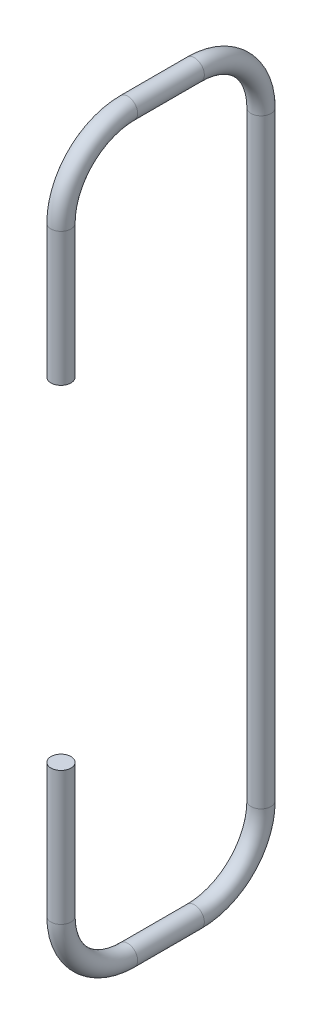
ISO-10303-21;
HEADER;
FILE_DESCRIPTION(('STEP AP214'),'2;1');
FILE_NAME('part.step','',(''),(''),'','','');
FILE_SCHEMA(('AUTOMOTIVE_DESIGN { 1 0 10303 214 1 1 1 1 }'));
ENDSEC;
DATA;
#1=APPLICATION_CONTEXT('core data for automotive mechanical design processes');
#2=APPLICATION_PROTOCOL_DEFINITION('international standard','automotive_design',2000,#1);
#3=PRODUCT_CONTEXT('',#1,'mechanical');
#4=PRODUCT('Part','Part','',(#3));
#5=PRODUCT_RELATED_PRODUCT_CATEGORY('part','',(#4));
#6=PRODUCT_DEFINITION_FORMATION('','',#4);
#7=PRODUCT_DEFINITION_CONTEXT('part definition',#1,'design');
#8=PRODUCT_DEFINITION('design','',#6,#7);
#9=PRODUCT_DEFINITION_SHAPE('','',#8);
#10=(LENGTH_UNIT() NAMED_UNIT(*) SI_UNIT(.MILLI.,.METRE.));
#11=(NAMED_UNIT(*) PLANE_ANGLE_UNIT() SI_UNIT($,.RADIAN.));
#12=(NAMED_UNIT(*) SI_UNIT($,.STERADIAN.) SOLID_ANGLE_UNIT());
#13=UNCERTAINTY_MEASURE_WITH_UNIT(LENGTH_MEASURE(1.E-05),#10,'distance_accuracy_value','');
#14=(GEOMETRIC_REPRESENTATION_CONTEXT(3) GLOBAL_UNCERTAINTY_ASSIGNED_CONTEXT((#13)) GLOBAL_UNIT_ASSIGNED_CONTEXT((#10,
#11,#12)) REPRESENTATION_CONTEXT('',''));
#15=CARTESIAN_POINT('',(0.,0.,0.));
#16=DIRECTION('',(0.,0.,1.));
#17=DIRECTION('',(1.,0.,0.));
#18=AXIS2_PLACEMENT_3D('',#15,#16,#17);
#19=CARTESIAN_POINT('',(0.,25.,30.));
#20=DIRECTION('',(0.,-1.,0.));
#21=DIRECTION('',(0.,0.,-1.));
#22=AXIS2_PLACEMENT_3D('',#19,#20,#21);
#23=PLANE('',#22);
#24=CARTESIAN_POINT('',(0.,25.,30.));
#25=DIRECTION('',(0.,-1.,0.));
#26=DIRECTION('',(0.,0.,-1.));
#27=AXIS2_PLACEMENT_3D('',#24,#25,#26);
#28=CIRCLE('',#27,1.5);
#29=CARTESIAN_POINT('',(0.,25.,28.5));
#30=VERTEX_POINT('',#29);
#31=EDGE_CURVE('E52',#30,#30,#28,.T.);
#32=ORIENTED_EDGE('',*,*,#31,.T.);
#33=EDGE_LOOP('',(#32));
#34=FACE_BOUND('',#33,.T.);
#35=ADVANCED_FACE('F33',(#34),#23,.T.);
#36=CARTESIAN_POINT('',(0.,25.,30.));
#37=DIRECTION('',(0.,1.,0.));
#38=DIRECTION('',(0.,0.,1.));
#39=AXIS2_PLACEMENT_3D('',#36,#37,#38);
#40=CYLINDRICAL_SURFACE('',#39,1.5);
#41=CARTESIAN_POINT('',(0.,45.,30.));
#42=DIRECTION('',(0.,-1.,0.));
#43=DIRECTION('',(0.,0.,-1.));
#44=AXIS2_PLACEMENT_3D('',#41,#42,#43);
#45=CIRCLE('',#44,1.5);
#46=CARTESIAN_POINT('',(0.,45.,31.5));
#47=VERTEX_POINT('',#46);
#48=EDGE_CURVE('E47',#47,#47,#45,.T.);
#49=ORIENTED_EDGE('',*,*,#48,.T.);
#50=EDGE_LOOP('',(#49));
#51=FACE_BOUND('',#50,.T.);
#52=ORIENTED_EDGE('',*,*,#31,.F.);
#53=EDGE_LOOP('',(#52));
#54=FACE_BOUND('',#53,.T.);
#55=ADVANCED_FACE('F89',(#51,#54),#40,.T.);
#56=CARTESIAN_POINT('',(0.,45.,20.));
#57=DIRECTION('',(-1.,0.,0.));
#58=DIRECTION('',(0.,0.,1.));
#59=AXIS2_PLACEMENT_3D('',#56,#57,#58);
#60=TOROIDAL_SURFACE('',#59,10.,1.5);
#61=CARTESIAN_POINT('',(0.,55.,20.));
#62=DIRECTION('',(0.,0.,1.));
#63=DIRECTION('',(0.,-1.,0.));
#64=AXIS2_PLACEMENT_3D('',#61,#62,#63);
#65=CIRCLE('',#64,1.5);
#66=CARTESIAN_POINT('',(0.,56.5,20.));
#67=VERTEX_POINT('',#66);
#68=EDGE_CURVE('E43',#67,#67,#65,.T.);
#69=CARTESIAN_POINT('',(0.,45.,20.));
#70=DIRECTION('',(-1.,0.,0.));
#71=DIRECTION('',(0.,0.,1.));
#72=AXIS2_PLACEMENT_3D('',#69,#70,#71);
#73=CIRCLE('',#72,11.5);
#74=EDGE_CURVE('',#47,#67,#73,.T.);
#75=ORIENTED_EDGE('',*,*,#48,.F.);
#76=ORIENTED_EDGE('',*,*,#68,.T.);
#77=ORIENTED_EDGE('',*,*,#74,.T.);
#78=ORIENTED_EDGE('',*,*,#74,.F.);
#79=EDGE_LOOP('',(#75,#77,#76,#78));
#80=FACE_BOUND('',#79,.T.);
#81=ADVANCED_FACE('F94',(#80),#60,.T.);
#82=CARTESIAN_POINT('',(0.,55.,20.));
#83=DIRECTION('',(0.,0.,-1.));
#84=DIRECTION('',(-1.,0.,0.));
#85=AXIS2_PLACEMENT_3D('',#82,#83,#84);
#86=CYLINDRICAL_SURFACE('',#85,1.5);
#87=CARTESIAN_POINT('',(0.,55.,9.99999999999999));
#88=DIRECTION('',(0.,0.,1.));
#89=DIRECTION('',(0.,-1.,0.));
#90=AXIS2_PLACEMENT_3D('',#87,#88,#89);
#91=CIRCLE('',#90,1.5);
#92=CARTESIAN_POINT('',(0.,56.5,9.99999999999999));
#93=VERTEX_POINT('',#92);
#94=EDGE_CURVE('E39',#93,#93,#91,.T.);
#95=ORIENTED_EDGE('',*,*,#94,.T.);
#96=EDGE_LOOP('',(#95));
#97=FACE_BOUND('',#96,.T.);
#98=ORIENTED_EDGE('',*,*,#68,.F.);
#99=EDGE_LOOP('',(#98));
#100=FACE_BOUND('',#99,.T.);
#101=ADVANCED_FACE('F101',(#97,#100),#86,.T.);
#102=CARTESIAN_POINT('',(0.,45.,10.));
#103=DIRECTION('',(-1.,0.,0.));
#104=DIRECTION('',(0.,0.,1.));
#105=AXIS2_PLACEMENT_3D('',#102,#103,#104);
#106=TOROIDAL_SURFACE('',#105,9.99999999999999,1.5);
#107=CARTESIAN_POINT('',(0.,45.,0.));
#108=DIRECTION('',(0.,1.,0.));
#109=DIRECTION('',(0.,0.,1.));
#110=AXIS2_PLACEMENT_3D('',#107,#108,#109);
#111=CIRCLE('',#110,1.5);
#112=CARTESIAN_POINT('',(0.,45.,-1.49999999999999));
#113=VERTEX_POINT('',#112);
#114=EDGE_CURVE('E10',#113,#113,#111,.T.);
#115=CARTESIAN_POINT('',(0.,45.,10.));
#116=DIRECTION('',(-1.,0.,0.));
#117=DIRECTION('',(0.,0.,1.));
#118=AXIS2_PLACEMENT_3D('',#115,#116,#117);
#119=CIRCLE('',#118,11.5);
#120=EDGE_CURVE('',#93,#113,#119,.T.);
#121=ORIENTED_EDGE('',*,*,#94,.F.);
#122=ORIENTED_EDGE('',*,*,#114,.T.);
#123=ORIENTED_EDGE('',*,*,#120,.T.);
#124=ORIENTED_EDGE('',*,*,#120,.F.);
#125=EDGE_LOOP('',(#121,#123,#122,#124));
#126=FACE_BOUND('',#125,.T.);
#127=ADVANCED_FACE('F84',(#126),#106,.T.);
#128=CARTESIAN_POINT('',(0.,45.,0.));
#129=DIRECTION('',(0.,-1.,0.));
#130=DIRECTION('',(0.,0.,-1.));
#131=AXIS2_PLACEMENT_3D('',#128,#129,#130);
#132=CYLINDRICAL_SURFACE('',#131,1.5);
#133=CARTESIAN_POINT('',(0.,-45.,0.));
#134=DIRECTION('',(0.,1.,0.));
#135=DIRECTION('',(0.,0.,1.));
#136=AXIS2_PLACEMENT_3D('',#133,#134,#135);
#137=CIRCLE('',#136,1.5);
#138=CARTESIAN_POINT('',(0.,-45.,-1.5));
#139=VERTEX_POINT('',#138);
#140=EDGE_CURVE('E55',#139,#139,#137,.T.);
#141=CARTESIAN_POINT('',(0.,45.,-1.5));
#142=CARTESIAN_POINT('',(0.,44.0625,-1.5));
#143=CARTESIAN_POINT('',(0.,43.125,-1.5));
#144=CARTESIAN_POINT('',(0.,41.25,-1.5));
#145=CARTESIAN_POINT('',(0.,40.3125,-1.5));
#146=CARTESIAN_POINT('',(0.,38.4375,-1.5));
#147=CARTESIAN_POINT('',(0.,37.5,-1.5));
#148=CARTESIAN_POINT('',(0.,35.625,-1.5));
#149=CARTESIAN_POINT('',(0.,34.6875,-1.5));
#150=CARTESIAN_POINT('',(0.,32.8125,-1.5));
#151=CARTESIAN_POINT('',(0.,31.875,-1.5));
#152=CARTESIAN_POINT('',(0.,30.,-1.5));
#153=CARTESIAN_POINT('',(0.,29.0625,-1.5));
#154=CARTESIAN_POINT('',(0.,27.1875,-1.5));
#155=CARTESIAN_POINT('',(0.,26.25,-1.5));
#156=CARTESIAN_POINT('',(0.,24.375,-1.5));
#157=CARTESIAN_POINT('',(0.,23.4375,-1.5));
#158=CARTESIAN_POINT('',(0.,21.5625,-1.5));
#159=CARTESIAN_POINT('',(0.,20.625,-1.5));
#160=CARTESIAN_POINT('',(0.,18.75,-1.5));
#161=CARTESIAN_POINT('',(0.,17.8125,-1.5));
#162=CARTESIAN_POINT('',(0.,15.9375,-1.5));
#163=CARTESIAN_POINT('',(0.,15.,-1.5));
#164=CARTESIAN_POINT('',(0.,13.125,-1.5));
#165=CARTESIAN_POINT('',(0.,12.1875,-1.5));
#166=CARTESIAN_POINT('',(0.,10.3125,-1.5));
#167=CARTESIAN_POINT('',(0.,9.37499999999999,-1.5));
#168=CARTESIAN_POINT('',(0.,7.49999999999999,-1.5));
#169=CARTESIAN_POINT('',(0.,6.56249999999999,-1.5));
#170=CARTESIAN_POINT('',(0.,4.68749999999999,-1.5));
#171=CARTESIAN_POINT('',(0.,3.74999999999999,-1.5));
#172=CARTESIAN_POINT('',(0.,1.87499999999999,-1.5));
#173=CARTESIAN_POINT('',(0.,0.937499999999994,-1.5));
#174=CARTESIAN_POINT('',(0.,-0.937500000000008,-1.5));
#175=CARTESIAN_POINT('',(0.,-1.87500000000001,-1.5));
#176=CARTESIAN_POINT('',(0.,-3.75000000000001,-1.5));
#177=CARTESIAN_POINT('',(0.,-4.68750000000001,-1.5));
#178=CARTESIAN_POINT('',(0.,-6.56250000000001,-1.5));
#179=CARTESIAN_POINT('',(0.,-7.50000000000001,-1.5));
#180=CARTESIAN_POINT('',(0.,-9.37500000000001,-1.5));
#181=CARTESIAN_POINT('',(0.,-10.3125,-1.5));
#182=CARTESIAN_POINT('',(0.,-12.1875,-1.5));
#183=CARTESIAN_POINT('',(0.,-13.125,-1.5));
#184=CARTESIAN_POINT('',(0.,-15.,-1.5));
#185=CARTESIAN_POINT('',(0.,-15.9375,-1.5));
#186=CARTESIAN_POINT('',(0.,-17.8125,-1.5));
#187=CARTESIAN_POINT('',(0.,-18.75,-1.5));
#188=CARTESIAN_POINT('',(0.,-20.625,-1.5));
#189=CARTESIAN_POINT('',(0.,-21.5625,-1.5));
#190=CARTESIAN_POINT('',(0.,-23.4375,-1.5));
#191=CARTESIAN_POINT('',(0.,-24.375,-1.5));
#192=CARTESIAN_POINT('',(0.,-26.25,-1.5));
#193=CARTESIAN_POINT('',(0.,-27.1875,-1.5));
#194=CARTESIAN_POINT('',(0.,-29.0625,-1.5));
#195=CARTESIAN_POINT('',(0.,-30.,-1.5));
#196=CARTESIAN_POINT('',(0.,-31.875,-1.5));
#197=CARTESIAN_POINT('',(0.,-32.8125,-1.5));
#198=CARTESIAN_POINT('',(0.,-34.6875,-1.5));
#199=CARTESIAN_POINT('',(0.,-35.625,-1.5));
#200=CARTESIAN_POINT('',(0.,-37.5,-1.5));
#201=CARTESIAN_POINT('',(0.,-38.4375,-1.5));
#202=CARTESIAN_POINT('',(0.,-40.3125,-1.5));
#203=CARTESIAN_POINT('',(0.,-41.25,-1.5));
#204=CARTESIAN_POINT('',(0.,-43.125,-1.5));
#205=CARTESIAN_POINT('',(0.,-44.0625,-1.5));
#206=CARTESIAN_POINT('',(0.,-45.,-1.5));
#207=B_SPLINE_CURVE_WITH_KNOTS('',3,(#141,#142,#143,#144,#145,#146,#147,#148,#149,#150,#151,
#152,#153,#154,#155,#156,#157,#158,#159,#160,#161,#162,#163,#164,#165,#166,#167,#168,#169,#170,
#171,#172,#173,#174,#175,#176,#177,#178,#179,#180,#181,#182,#183,#184,#185,#186,#187,#188,#189,
#190,#191,#192,#193,#194,#195,#196,#197,#198,#199,#200,#201,#202,#203,#204,#205,#206),
.UNSPECIFIED.,.F.,.F.,(4,2,2,2,2,2,2,2,2,2,2,2,2,2,2,2,2,2,2,2,2,2,2,2,2,2,2,2,2,2,2,2,4),(0.,
2.8125,5.62500000000001,8.4375,11.25,14.0625,16.875,19.6875,22.5,25.3125,28.125,30.9375,33.75,
36.5625,39.375,42.1875,45.,47.8125,50.625,53.4375,56.25,59.0625,61.875,64.6875,67.5,70.3125,
73.125,75.9375,78.75,81.5625,84.375,87.1875,90.),.UNSPECIFIED.);
#208=EDGE_CURVE('BSEAM75',#113,#139,#207,.T.);
#209=ORIENTED_EDGE('',*,*,#114,.F.);
#210=ORIENTED_EDGE('',*,*,#140,.T.);
#211=ORIENTED_EDGE('',*,*,#208,.T.);
#212=ORIENTED_EDGE('',*,*,#208,.F.);
#213=EDGE_LOOP('',(#209,#211,#210,#212));
#214=FACE_BOUND('',#213,.T.);
#215=ADVANCED_FACE('F75',(#214),#132,.T.);
#216=CARTESIAN_POINT('',(0.,-25.,30.));
#217=DIRECTION('',(0.,1.,0.));
#218=DIRECTION('',(0.,0.,-1.));
#219=AXIS2_PLACEMENT_3D('',#216,#217,#218);
#220=PLANE('',#219);
#221=CARTESIAN_POINT('',(0.,-25.,30.));
#222=DIRECTION('',(0.,-1.,0.));
#223=DIRECTION('',(0.,0.,-1.));
#224=AXIS2_PLACEMENT_3D('',#221,#222,#223);
#225=CIRCLE('',#224,1.5);
#226=CARTESIAN_POINT('',(0.,-25.,28.5));
#227=VERTEX_POINT('',#226);
#228=EDGE_CURVE('E67',#227,#227,#225,.T.);
#229=ORIENTED_EDGE('',*,*,#228,.F.);
#230=EDGE_LOOP('',(#229));
#231=FACE_BOUND('',#230,.T.);
#232=ADVANCED_FACE('F73',(#231),#220,.T.);
#233=CARTESIAN_POINT('',(0.,-25.,30.));
#234=DIRECTION('',(0.,-1.,0.));
#235=DIRECTION('',(0.,0.,1.));
#236=AXIS2_PLACEMENT_3D('',#233,#234,#235);
#237=CYLINDRICAL_SURFACE('',#236,1.5);
#238=CARTESIAN_POINT('',(0.,-45.,30.));
#239=DIRECTION('',(0.,-1.,0.));
#240=DIRECTION('',(0.,0.,-1.));
#241=AXIS2_PLACEMENT_3D('',#238,#239,#240);
#242=CIRCLE('',#241,1.5);
#243=CARTESIAN_POINT('',(0.,-45.,31.5));
#244=VERTEX_POINT('',#243);
#245=EDGE_CURVE('E64',#244,#244,#242,.T.);
#246=ORIENTED_EDGE('',*,*,#245,.F.);
#247=EDGE_LOOP('',(#246));
#248=FACE_BOUND('',#247,.T.);
#249=ORIENTED_EDGE('',*,*,#228,.T.);
#250=EDGE_LOOP('',(#249));
#251=FACE_BOUND('',#250,.T.);
#252=ADVANCED_FACE('F71',(#248,#251),#237,.T.);
#253=CARTESIAN_POINT('',(0.,-45.,20.));
#254=DIRECTION('',(-1.,0.,0.));
#255=DIRECTION('',(0.,0.,1.));
#256=AXIS2_PLACEMENT_3D('',#253,#254,#255);
#257=TOROIDAL_SURFACE('',#256,10.,1.5);
#258=CARTESIAN_POINT('',(0.,-55.,20.));
#259=DIRECTION('',(0.,0.,-1.));
#260=DIRECTION('',(0.,1.,0.));
#261=AXIS2_PLACEMENT_3D('',#258,#259,#260);
#262=CIRCLE('',#261,1.5);
#263=CARTESIAN_POINT('',(0.,-56.5,20.));
#264=VERTEX_POINT('',#263);
#265=EDGE_CURVE('E61',#264,#264,#262,.T.);
#266=CARTESIAN_POINT('',(0.,-45.,20.));
#267=DIRECTION('',(-1.,0.,0.));
#268=DIRECTION('',(0.,0.,1.));
#269=AXIS2_PLACEMENT_3D('',#266,#267,#268);
#270=CIRCLE('',#269,11.5);
#271=EDGE_CURVE('',#264,#244,#270,.T.);
#272=ORIENTED_EDGE('',*,*,#265,.F.);
#273=ORIENTED_EDGE('',*,*,#245,.T.);
#274=ORIENTED_EDGE('',*,*,#271,.T.);
#275=ORIENTED_EDGE('',*,*,#271,.F.);
#276=EDGE_LOOP('',(#272,#274,#273,#275));
#277=FACE_BOUND('',#276,.T.);
#278=ADVANCED_FACE('F81',(#277),#257,.T.);
#279=CARTESIAN_POINT('',(0.,-55.,20.));
#280=DIRECTION('',(0.,0.,-1.));
#281=DIRECTION('',(-1.,0.,0.));
#282=AXIS2_PLACEMENT_3D('',#279,#280,#281);
#283=CYLINDRICAL_SURFACE('',#282,1.5);
#284=CARTESIAN_POINT('',(0.,-55.,9.99999999999999));
#285=DIRECTION('',(0.,0.,-1.));
#286=DIRECTION('',(0.,1.,0.));
#287=AXIS2_PLACEMENT_3D('',#284,#285,#286);
#288=CIRCLE('',#287,1.5);
#289=CARTESIAN_POINT('',(0.,-56.5,9.99999999999999));
#290=VERTEX_POINT('',#289);
#291=EDGE_CURVE('E58',#290,#290,#288,.T.);
#292=ORIENTED_EDGE('',*,*,#291,.F.);
#293=EDGE_LOOP('',(#292));
#294=FACE_BOUND('',#293,.T.);
#295=ORIENTED_EDGE('',*,*,#265,.T.);
#296=EDGE_LOOP('',(#295));
#297=FACE_BOUND('',#296,.T.);
#298=ADVANCED_FACE('F141',(#294,#297),#283,.T.);
#299=CARTESIAN_POINT('',(0.,-45.,10.));
#300=DIRECTION('',(-1.,0.,0.));
#301=DIRECTION('',(0.,0.,1.));
#302=AXIS2_PLACEMENT_3D('',#299,#300,#301);
#303=TOROIDAL_SURFACE('',#302,9.99999999999999,1.5);
#304=CARTESIAN_POINT('',(0.,-45.,10.));
#305=DIRECTION('',(-1.,0.,0.));
#306=DIRECTION('',(0.,0.,1.));
#307=AXIS2_PLACEMENT_3D('',#304,#305,#306);
#308=CIRCLE('',#307,11.5);
#309=EDGE_CURVE('',#139,#290,#308,.T.);
#310=ORIENTED_EDGE('',*,*,#140,.F.);
#311=ORIENTED_EDGE('',*,*,#291,.T.);
#312=ORIENTED_EDGE('',*,*,#309,.T.);
#313=ORIENTED_EDGE('',*,*,#309,.F.);
#314=EDGE_LOOP('',(#310,#312,#311,#313));
#315=FACE_BOUND('',#314,.T.);
#316=ADVANCED_FACE('F151',(#315),#303,.T.);
#317=CLOSED_SHELL('',(#35,#55,#81,#101,#127,#215,#232,#252,#278,#298,#316));
#318=MANIFOLD_SOLID_BREP('B2',#317);
#319=ADVANCED_BREP_SHAPE_REPRESENTATION('',(#18,#318),#14);
#320=SHAPE_DEFINITION_REPRESENTATION(#9,#319);
ENDSEC;
END-ISO-10303-21;
